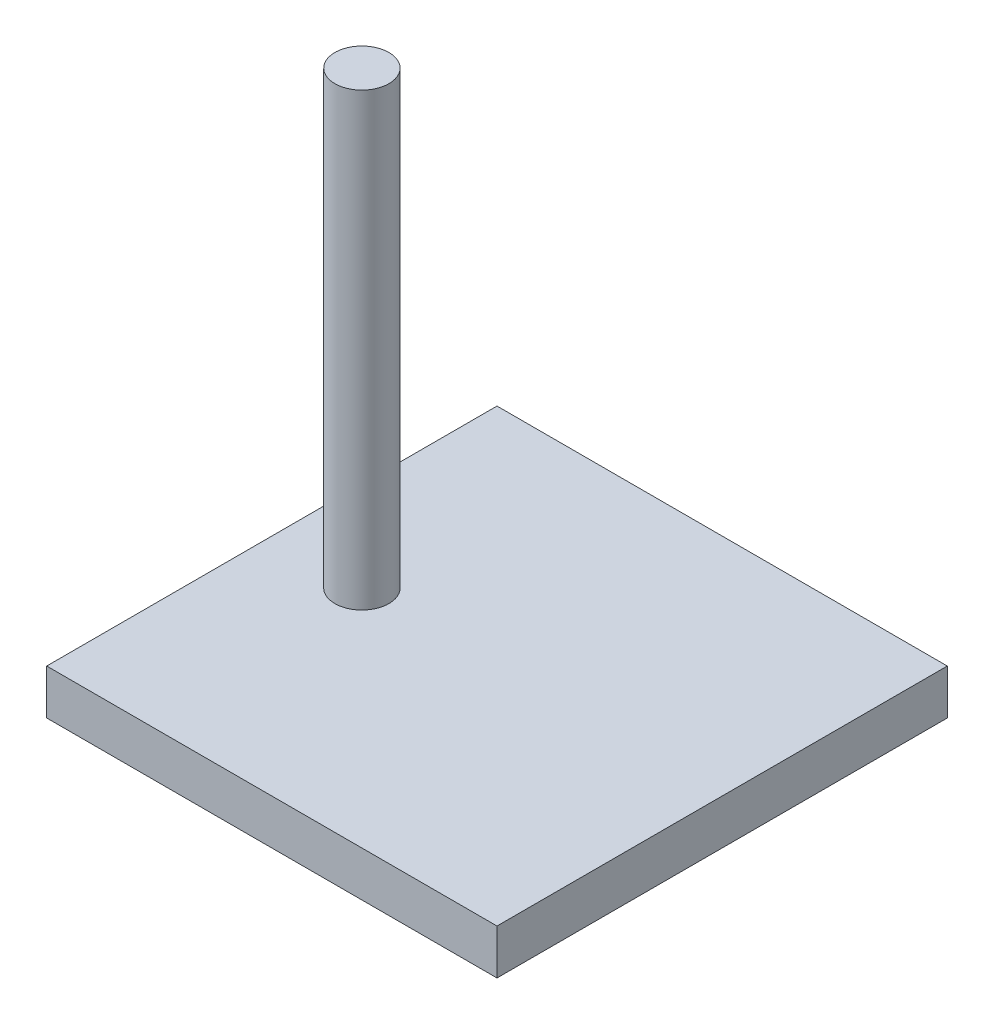
ISO-10303-21;
HEADER;
FILE_DESCRIPTION(('STEP AP214'),'2;1');
FILE_NAME('part.step','',(''),(''),'','','');
FILE_SCHEMA(('AUTOMOTIVE_DESIGN { 1 0 10303 214 1 1 1 1 }'));
ENDSEC;
DATA;
#1=APPLICATION_CONTEXT('core data for automotive mechanical design processes');
#2=APPLICATION_PROTOCOL_DEFINITION('international standard','automotive_design',2000,#1);
#3=PRODUCT_CONTEXT('',#1,'mechanical');
#4=PRODUCT('Part','Part','',(#3));
#5=PRODUCT_RELATED_PRODUCT_CATEGORY('part','',(#4));
#6=PRODUCT_DEFINITION_FORMATION('','',#4);
#7=PRODUCT_DEFINITION_CONTEXT('part definition',#1,'design');
#8=PRODUCT_DEFINITION('design','',#6,#7);
#9=PRODUCT_DEFINITION_SHAPE('','',#8);
#10=(LENGTH_UNIT() NAMED_UNIT(*) SI_UNIT(.MILLI.,.METRE.));
#11=(NAMED_UNIT(*) PLANE_ANGLE_UNIT() SI_UNIT($,.RADIAN.));
#12=(NAMED_UNIT(*) SI_UNIT($,.STERADIAN.) SOLID_ANGLE_UNIT());
#13=UNCERTAINTY_MEASURE_WITH_UNIT(LENGTH_MEASURE(1.E-05),#10,'distance_accuracy_value','');
#14=(GEOMETRIC_REPRESENTATION_CONTEXT(3) GLOBAL_UNCERTAINTY_ASSIGNED_CONTEXT((#13)) GLOBAL_UNIT_ASSIGNED_CONTEXT((#10,
#11,#12)) REPRESENTATION_CONTEXT('',''));
#15=CARTESIAN_POINT('',(0.,0.,0.));
#16=DIRECTION('',(0.,0.,1.));
#17=DIRECTION('',(1.,0.,0.));
#18=AXIS2_PLACEMENT_3D('',#15,#16,#17);
#19=CARTESIAN_POINT('',(0.,10.,0.));
#20=DIRECTION('',(0.,1.,0.));
#21=DIRECTION('',(0.,0.,1.));
#22=AXIS2_PLACEMENT_3D('',#19,#20,#21);
#23=PLANE('',#22);
#24=DIRECTION('',(0.,0.,1.));
#25=VECTOR('',#24,1.);
#26=CARTESIAN_POINT('',(-50.,10.,-50.));
#27=LINE('',#26,#25);
#28=CARTESIAN_POINT('',(-50.,10.,-50.));
#29=VERTEX_POINT('',#28);
#30=CARTESIAN_POINT('',(-50.,10.,50.));
#31=VERTEX_POINT('',#30);
#32=EDGE_CURVE('E85',#29,#31,#27,.T.);
#33=ORIENTED_EDGE('',*,*,#32,.T.);
#34=DIRECTION('',(1.,0.,0.));
#35=VECTOR('',#34,1.);
#36=CARTESIAN_POINT('',(-50.,10.,50.));
#37=LINE('',#36,#35);
#38=CARTESIAN_POINT('',(50.0000000000001,10.,50.));
#39=VERTEX_POINT('',#38);
#40=EDGE_CURVE('E80',#31,#39,#37,.T.);
#41=ORIENTED_EDGE('',*,*,#40,.T.);
#42=DIRECTION('',(0.,0.,-1.));
#43=VECTOR('',#42,1.);
#44=CARTESIAN_POINT('',(50.,10.,-50.));
#45=LINE('',#44,#43);
#46=CARTESIAN_POINT('',(50.,10.,-50.));
#47=VERTEX_POINT('',#46);
#48=EDGE_CURVE('E83',#39,#47,#45,.T.);
#49=ORIENTED_EDGE('',*,*,#48,.T.);
#50=DIRECTION('',(-1.,0.,0.));
#51=VECTOR('',#50,1.);
#52=CARTESIAN_POINT('',(-50.,10.,-50.));
#53=LINE('',#52,#51);
#54=EDGE_CURVE('E50',#47,#29,#53,.T.);
#55=ORIENTED_EDGE('',*,*,#54,.T.);
#56=EDGE_LOOP('',(#33,#41,#49,#55));
#57=FACE_BOUND('',#56,.T.);
#58=CARTESIAN_POINT('',(-30.,10.,0.));
#59=DIRECTION('',(0.,1.,0.));
#60=DIRECTION('',(0.,0.,1.));
#61=AXIS2_PLACEMENT_3D('',#58,#59,#60);
#62=CIRCLE('',#61,6.);
#63=CARTESIAN_POINT('',(-30.,10.,6.));
#64=VERTEX_POINT('',#63);
#65=EDGE_CURVE('E111',#64,#64,#62,.T.);
#66=ORIENTED_EDGE('',*,*,#65,.F.);
#67=EDGE_LOOP('',(#66));
#68=FACE_BOUND('',#67,.T.);
#69=ADVANCED_FACE('F33',(#57,#68),#23,.T.);
#70=CARTESIAN_POINT('',(-50.,10.,-50.));
#71=DIRECTION('',(1.,0.,0.));
#72=DIRECTION('',(0.,0.,-1.));
#73=AXIS2_PLACEMENT_3D('',#70,#71,#72);
#74=PLANE('',#73);
#75=DIRECTION('',(0.,0.,1.));
#76=VECTOR('',#75,1.);
#77=CARTESIAN_POINT('',(-50.,0.,-50.));
#78=LINE('',#77,#76);
#79=CARTESIAN_POINT('',(-50.,0.,-50.));
#80=VERTEX_POINT('',#79);
#81=CARTESIAN_POINT('',(-50.,0.,50.));
#82=VERTEX_POINT('',#81);
#83=EDGE_CURVE('E97',#80,#82,#78,.T.);
#84=ORIENTED_EDGE('',*,*,#83,.T.);
#85=DIRECTION('',(0.,-1.,0.));
#86=VECTOR('',#85,1.);
#87=CARTESIAN_POINT('',(-50.,10.,50.));
#88=LINE('',#87,#86);
#89=EDGE_CURVE('E11',#31,#82,#88,.T.);
#90=ORIENTED_EDGE('',*,*,#89,.F.);
#91=ORIENTED_EDGE('',*,*,#32,.F.);
#92=DIRECTION('',(0.,-1.,0.));
#93=VECTOR('',#92,1.);
#94=CARTESIAN_POINT('',(-50.,10.,-50.));
#95=LINE('',#94,#93);
#96=EDGE_CURVE('E93',#29,#80,#95,.T.);
#97=ORIENTED_EDGE('',*,*,#96,.T.);
#98=EDGE_LOOP('',(#84,#90,#91,#97));
#99=FACE_BOUND('',#98,.T.);
#100=ADVANCED_FACE('F35',(#99),#74,.F.);
#101=CARTESIAN_POINT('',(-50.,10.,50.));
#102=DIRECTION('',(0.,0.,-1.));
#103=DIRECTION('',(-1.,0.,0.));
#104=AXIS2_PLACEMENT_3D('',#101,#102,#103);
#105=PLANE('',#104);
#106=DIRECTION('',(1.,0.,0.));
#107=VECTOR('',#106,1.);
#108=CARTESIAN_POINT('',(-50.,0.,50.));
#109=LINE('',#108,#107);
#110=CARTESIAN_POINT('',(50.0000000000001,0.,50.));
#111=VERTEX_POINT('',#110);
#112=EDGE_CURVE('E89',#82,#111,#109,.T.);
#113=ORIENTED_EDGE('',*,*,#112,.T.);
#114=DIRECTION('',(0.,-1.,0.));
#115=VECTOR('',#114,1.);
#116=CARTESIAN_POINT('',(50.0000000000001,10.,50.));
#117=LINE('',#116,#115);
#118=EDGE_CURVE('E42',#39,#111,#117,.T.);
#119=ORIENTED_EDGE('',*,*,#118,.F.);
#120=ORIENTED_EDGE('',*,*,#40,.F.);
#121=ORIENTED_EDGE('',*,*,#89,.T.);
#122=EDGE_LOOP('',(#113,#119,#120,#121));
#123=FACE_BOUND('',#122,.T.);
#124=ADVANCED_FACE('F88',(#123),#105,.F.);
#125=CARTESIAN_POINT('',(50.,10.,-50.));
#126=DIRECTION('',(-1.,0.,0.));
#127=DIRECTION('',(0.,0.,1.));
#128=AXIS2_PLACEMENT_3D('',#125,#126,#127);
#129=PLANE('',#128);
#130=DIRECTION('',(0.,0.,-1.));
#131=VECTOR('',#130,1.);
#132=CARTESIAN_POINT('',(50.,0.,-50.));
#133=LINE('',#132,#131);
#134=CARTESIAN_POINT('',(50.,0.,-50.));
#135=VERTEX_POINT('',#134);
#136=EDGE_CURVE('E67',#111,#135,#133,.T.);
#137=ORIENTED_EDGE('',*,*,#136,.T.);
#138=DIRECTION('',(0.,-1.,0.));
#139=VECTOR('',#138,1.);
#140=CARTESIAN_POINT('',(50.,10.,-50.));
#141=LINE('',#140,#139);
#142=EDGE_CURVE('E90',#47,#135,#141,.T.);
#143=ORIENTED_EDGE('',*,*,#142,.F.);
#144=ORIENTED_EDGE('',*,*,#48,.F.);
#145=ORIENTED_EDGE('',*,*,#118,.T.);
#146=EDGE_LOOP('',(#137,#143,#144,#145));
#147=FACE_BOUND('',#146,.T.);
#148=ADVANCED_FACE('F91',(#147),#129,.F.);
#149=CARTESIAN_POINT('',(-50.,10.,-50.));
#150=DIRECTION('',(0.,0.,1.));
#151=DIRECTION('',(1.,0.,0.));
#152=AXIS2_PLACEMENT_3D('',#149,#150,#151);
#153=PLANE('',#152);
#154=DIRECTION('',(-1.,0.,0.));
#155=VECTOR('',#154,1.);
#156=CARTESIAN_POINT('',(-50.,0.,-50.));
#157=LINE('',#156,#155);
#158=EDGE_CURVE('E73',#135,#80,#157,.T.);
#159=ORIENTED_EDGE('',*,*,#158,.T.);
#160=ORIENTED_EDGE('',*,*,#96,.F.);
#161=ORIENTED_EDGE('',*,*,#54,.F.);
#162=ORIENTED_EDGE('',*,*,#142,.T.);
#163=EDGE_LOOP('',(#159,#160,#161,#162));
#164=FACE_BOUND('',#163,.T.);
#165=ADVANCED_FACE('F105',(#164),#153,.F.);
#166=CARTESIAN_POINT('',(0.,0.,0.));
#167=DIRECTION('',(0.,1.,0.));
#168=DIRECTION('',(0.,0.,1.));
#169=AXIS2_PLACEMENT_3D('',#166,#167,#168);
#170=PLANE('',#169);
#171=ORIENTED_EDGE('',*,*,#83,.F.);
#172=ORIENTED_EDGE('',*,*,#158,.F.);
#173=ORIENTED_EDGE('',*,*,#136,.F.);
#174=ORIENTED_EDGE('',*,*,#112,.F.);
#175=EDGE_LOOP('',(#171,#172,#173,#174));
#176=FACE_BOUND('',#175,.T.);
#177=ADVANCED_FACE('F108',(#176),#170,.F.);
#178=CARTESIAN_POINT('',(-30.,110.,0.));
#179=DIRECTION('',(0.,-1.,0.));
#180=DIRECTION('',(0.,0.,-1.));
#181=AXIS2_PLACEMENT_3D('',#178,#179,#180);
#182=CYLINDRICAL_SURFACE('',#181,6.);
#183=CARTESIAN_POINT('',(-30.,110.,0.));
#184=DIRECTION('',(0.,1.,0.));
#185=DIRECTION('',(0.,0.,1.));
#186=AXIS2_PLACEMENT_3D('',#183,#184,#185);
#187=CIRCLE('',#186,6.);
#188=CARTESIAN_POINT('',(-30.,110.,6.));
#189=VERTEX_POINT('',#188);
#190=EDGE_CURVE('E100',#189,#189,#187,.T.);
#191=ORIENTED_EDGE('',*,*,#190,.F.);
#192=EDGE_LOOP('',(#191));
#193=FACE_BOUND('',#192,.T.);
#194=ORIENTED_EDGE('',*,*,#65,.T.);
#195=EDGE_LOOP('',(#194));
#196=FACE_BOUND('',#195,.T.);
#197=ADVANCED_FACE('F119',(#193,#196),#182,.T.);
#198=CARTESIAN_POINT('',(-30.,110.,0.));
#199=DIRECTION('',(0.,1.,0.));
#200=DIRECTION('',(0.,0.,1.));
#201=AXIS2_PLACEMENT_3D('',#198,#199,#200);
#202=PLANE('',#201);
#203=ORIENTED_EDGE('',*,*,#190,.T.);
#204=EDGE_LOOP('',(#203));
#205=FACE_BOUND('',#204,.T.);
#206=ADVANCED_FACE('F117',(#205),#202,.T.);
#207=CLOSED_SHELL('',(#69,#100,#124,#148,#165,#177,#197,#206));
#208=MANIFOLD_SOLID_BREP('B2',#207);
#209=ADVANCED_BREP_SHAPE_REPRESENTATION('',(#18,#208),#14);
#210=SHAPE_DEFINITION_REPRESENTATION(#9,#209);
ENDSEC;
END-ISO-10303-21;
